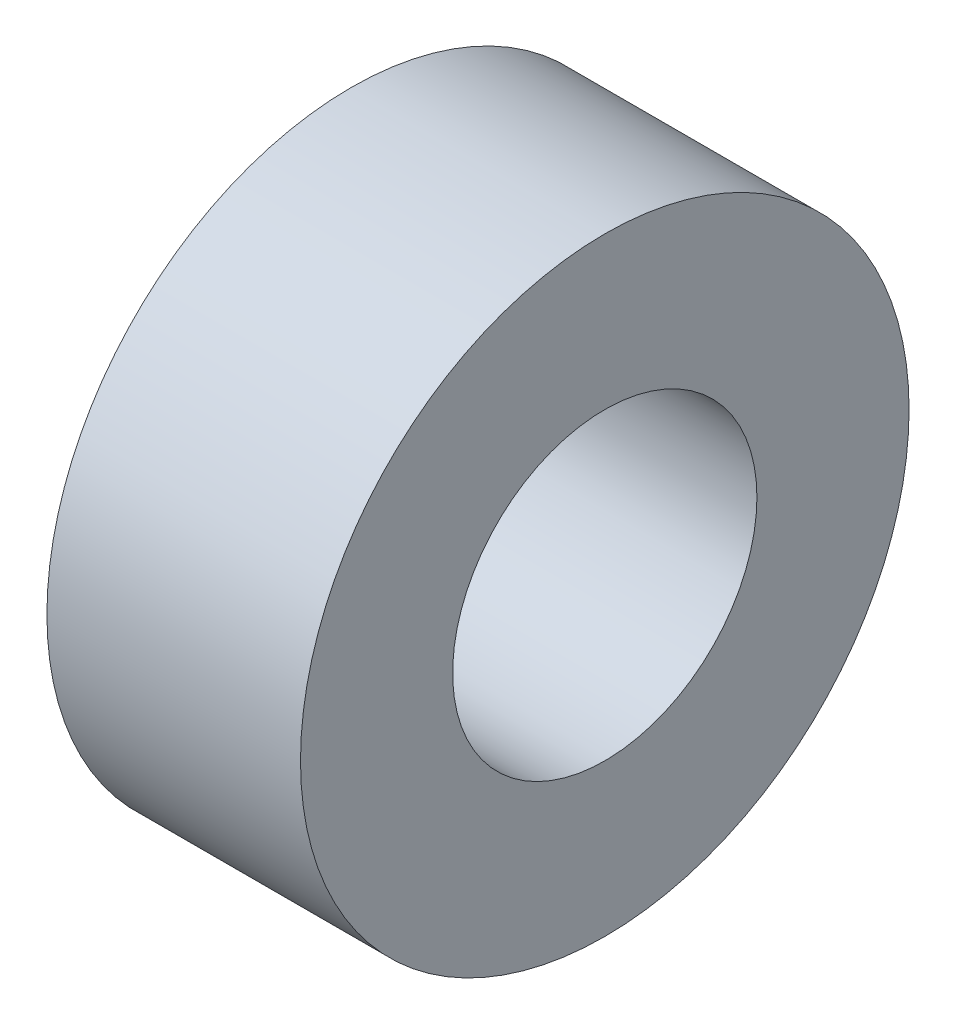
ISO-10303-21;
HEADER;
FILE_DESCRIPTION(('STEP AP214'),'2;1');
FILE_NAME('part.step','',(''),(''),'','','');
FILE_SCHEMA(('AUTOMOTIVE_DESIGN { 1 0 10303 214 1 1 1 1 }'));
ENDSEC;
DATA;
#1=APPLICATION_CONTEXT('core data for automotive mechanical design processes');
#2=APPLICATION_PROTOCOL_DEFINITION('international standard','automotive_design',2000,#1);
#3=PRODUCT_CONTEXT('',#1,'mechanical');
#4=PRODUCT('Part','Part','',(#3));
#5=PRODUCT_RELATED_PRODUCT_CATEGORY('part','',(#4));
#6=PRODUCT_DEFINITION_FORMATION('','',#4);
#7=PRODUCT_DEFINITION_CONTEXT('part definition',#1,'design');
#8=PRODUCT_DEFINITION('design','',#6,#7);
#9=PRODUCT_DEFINITION_SHAPE('','',#8);
#10=(LENGTH_UNIT() NAMED_UNIT(*) SI_UNIT(.MILLI.,.METRE.));
#11=(NAMED_UNIT(*) PLANE_ANGLE_UNIT() SI_UNIT($,.RADIAN.));
#12=(NAMED_UNIT(*) SI_UNIT($,.STERADIAN.) SOLID_ANGLE_UNIT());
#13=UNCERTAINTY_MEASURE_WITH_UNIT(LENGTH_MEASURE(1.E-05),#10,'distance_accuracy_value','');
#14=(GEOMETRIC_REPRESENTATION_CONTEXT(3) GLOBAL_UNCERTAINTY_ASSIGNED_CONTEXT((#13)) GLOBAL_UNIT_ASSIGNED_CONTEXT((#10,
#11,#12)) REPRESENTATION_CONTEXT('',''));
#15=CARTESIAN_POINT('',(0.,0.,0.));
#16=DIRECTION('',(0.,0.,1.));
#17=DIRECTION('',(1.,0.,0.));
#18=AXIS2_PLACEMENT_3D('',#15,#16,#17);
#19=CARTESIAN_POINT('',(1.25,0.,0.));
#20=DIRECTION('',(1.,0.,0.));
#21=DIRECTION('',(0.,0.,-1.));
#22=AXIS2_PLACEMENT_3D('',#19,#20,#21);
#23=PLANE('',#22);
#24=CARTESIAN_POINT('',(1.25,0.,0.));
#25=DIRECTION('',(1.,0.,0.));
#26=DIRECTION('',(0.,0.,-1.));
#27=AXIS2_PLACEMENT_3D('',#24,#25,#26);
#28=CIRCLE('',#27,3.);
#29=CARTESIAN_POINT('',(1.25,0.,-3.));
#30=VERTEX_POINT('',#29);
#31=EDGE_CURVE('E10',#30,#30,#28,.T.);
#32=ORIENTED_EDGE('',*,*,#31,.T.);
#33=EDGE_LOOP('',(#32));
#34=FACE_BOUND('',#33,.T.);
#35=CARTESIAN_POINT('',(1.25,0.,0.));
#36=DIRECTION('',(1.,0.,0.));
#37=DIRECTION('',(0.,0.,-1.));
#38=AXIS2_PLACEMENT_3D('',#35,#36,#37);
#39=CIRCLE('',#38,1.5);
#40=CARTESIAN_POINT('',(1.25,0.,-1.5));
#41=VERTEX_POINT('',#40);
#42=EDGE_CURVE('E42',#41,#41,#39,.T.);
#43=ORIENTED_EDGE('',*,*,#42,.F.);
#44=EDGE_LOOP('',(#43));
#45=FACE_BOUND('',#44,.T.);
#46=ADVANCED_FACE('F31',(#34,#45),#23,.T.);
#47=CARTESIAN_POINT('',(-1.25,0.,0.));
#48=DIRECTION('',(1.,0.,0.));
#49=DIRECTION('',(0.,0.,-1.));
#50=AXIS2_PLACEMENT_3D('',#47,#48,#49);
#51=PLANE('',#50);
#52=CARTESIAN_POINT('',(-1.25,0.,0.));
#53=DIRECTION('',(1.,0.,0.));
#54=DIRECTION('',(0.,0.,-1.));
#55=AXIS2_PLACEMENT_3D('',#52,#53,#54);
#56=CIRCLE('',#55,3.);
#57=CARTESIAN_POINT('',(-1.25,0.,-3.));
#58=VERTEX_POINT('',#57);
#59=EDGE_CURVE('E35',#58,#58,#56,.T.);
#60=ORIENTED_EDGE('',*,*,#59,.F.);
#61=EDGE_LOOP('',(#60));
#62=FACE_BOUND('',#61,.T.);
#63=CARTESIAN_POINT('',(-1.25,0.,0.));
#64=DIRECTION('',(1.,0.,0.));
#65=DIRECTION('',(0.,0.,-1.));
#66=AXIS2_PLACEMENT_3D('',#63,#64,#65);
#67=CIRCLE('',#66,1.5);
#68=CARTESIAN_POINT('',(-1.25,0.,-1.5));
#69=VERTEX_POINT('',#68);
#70=EDGE_CURVE('E44',#69,#69,#67,.T.);
#71=ORIENTED_EDGE('',*,*,#70,.T.);
#72=EDGE_LOOP('',(#71));
#73=FACE_BOUND('',#72,.T.);
#74=ADVANCED_FACE('F54',(#62,#73),#51,.F.);
#75=CARTESIAN_POINT('',(1.25,0.,0.));
#76=DIRECTION('',(-1.,0.,0.));
#77=DIRECTION('',(0.,0.,1.));
#78=AXIS2_PLACEMENT_3D('',#75,#76,#77);
#79=CYLINDRICAL_SURFACE('',#78,3.);
#80=ORIENTED_EDGE('',*,*,#31,.F.);
#81=EDGE_LOOP('',(#80));
#82=FACE_BOUND('',#81,.T.);
#83=ORIENTED_EDGE('',*,*,#59,.T.);
#84=EDGE_LOOP('',(#83));
#85=FACE_BOUND('',#84,.T.);
#86=ADVANCED_FACE('F33',(#82,#85),#79,.T.);
#87=CARTESIAN_POINT('',(1.25,0.,0.));
#88=DIRECTION('',(-1.,0.,0.));
#89=DIRECTION('',(0.,0.,1.));
#90=AXIS2_PLACEMENT_3D('',#87,#88,#89);
#91=CYLINDRICAL_SURFACE('',#90,1.5);
#92=ORIENTED_EDGE('',*,*,#42,.T.);
#93=EDGE_LOOP('',(#92));
#94=FACE_BOUND('',#93,.T.);
#95=ORIENTED_EDGE('',*,*,#70,.F.);
#96=EDGE_LOOP('',(#95));
#97=FACE_BOUND('',#96,.T.);
#98=ADVANCED_FACE('F50',(#94,#97),#91,.F.);
#99=CLOSED_SHELL('',(#46,#74,#86,#98));
#100=MANIFOLD_SOLID_BREP('B2',#99);
#101=ADVANCED_BREP_SHAPE_REPRESENTATION('',(#18,#100),#14);
#102=SHAPE_DEFINITION_REPRESENTATION(#9,#101);
ENDSEC;
END-ISO-10303-21;
